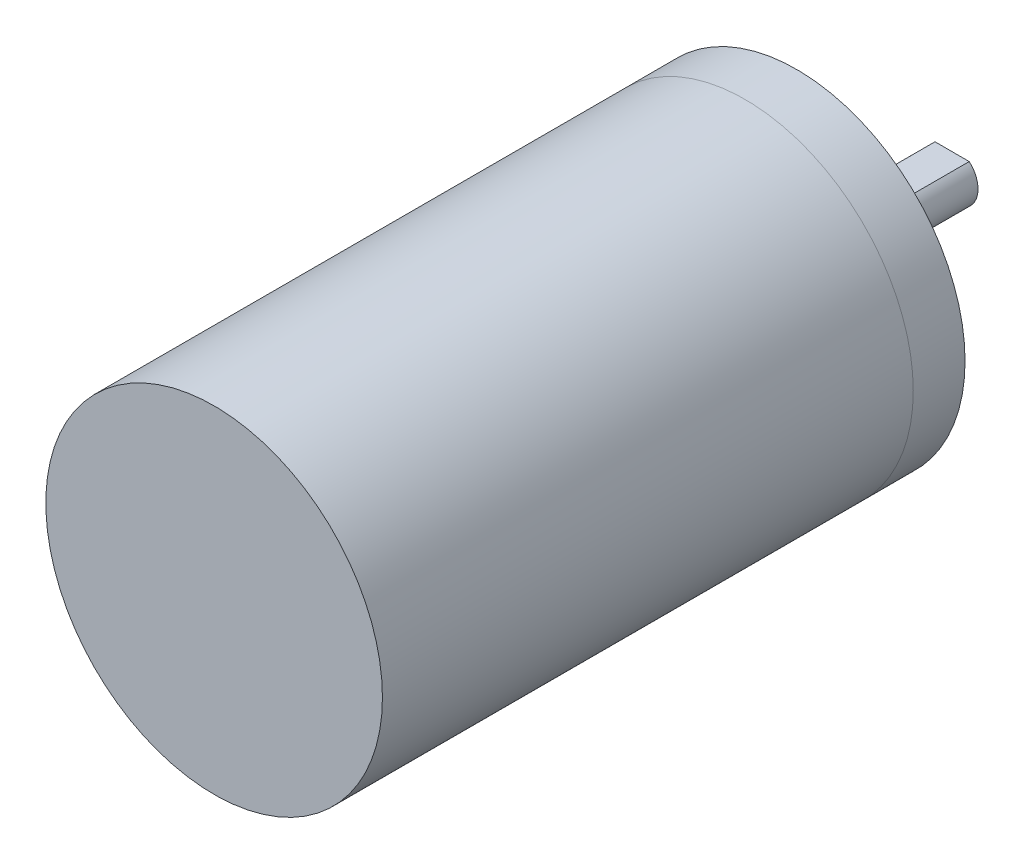
ISO-10303-21;
HEADER;
FILE_DESCRIPTION(('STEP AP214'),'2;1');
FILE_NAME('part.step','',(''),(''),'','','');
FILE_SCHEMA(('AUTOMOTIVE_DESIGN { 1 0 10303 214 1 1 1 1 }'));
ENDSEC;
DATA;
#1=APPLICATION_CONTEXT('core data for automotive mechanical design processes');
#2=APPLICATION_PROTOCOL_DEFINITION('international standard','automotive_design',2000,#1);
#3=PRODUCT_CONTEXT('',#1,'mechanical');
#4=PRODUCT('Part','Part','',(#3));
#5=PRODUCT_RELATED_PRODUCT_CATEGORY('part','',(#4));
#6=PRODUCT_DEFINITION_FORMATION('','',#4);
#7=PRODUCT_DEFINITION_CONTEXT('part definition',#1,'design');
#8=PRODUCT_DEFINITION('design','',#6,#7);
#9=PRODUCT_DEFINITION_SHAPE('','',#8);
#10=(LENGTH_UNIT() NAMED_UNIT(*) SI_UNIT(.MILLI.,.METRE.));
#11=(NAMED_UNIT(*) PLANE_ANGLE_UNIT() SI_UNIT($,.RADIAN.));
#12=(NAMED_UNIT(*) SI_UNIT($,.STERADIAN.) SOLID_ANGLE_UNIT());
#13=UNCERTAINTY_MEASURE_WITH_UNIT(LENGTH_MEASURE(1.E-05),#10,'distance_accuracy_value','');
#14=(GEOMETRIC_REPRESENTATION_CONTEXT(3) GLOBAL_UNCERTAINTY_ASSIGNED_CONTEXT((#13)) GLOBAL_UNIT_ASSIGNED_CONTEXT((#10,
#11,#12)) REPRESENTATION_CONTEXT('',''));
#15=CARTESIAN_POINT('',(0.,0.,0.));
#16=DIRECTION('',(0.,0.,1.));
#17=DIRECTION('',(1.,0.,0.));
#18=AXIS2_PLACEMENT_3D('',#15,#16,#17);
#19=CARTESIAN_POINT('',(0.,0.,45.));
#20=DIRECTION('',(0.,0.,-1.));
#21=DIRECTION('',(-1.,0.,0.));
#22=AXIS2_PLACEMENT_3D('',#19,#20,#21);
#23=CYLINDRICAL_SURFACE('',#22,13.);
#24=CARTESIAN_POINT('',(0.,0.,45.));
#25=DIRECTION('',(0.,0.,1.));
#26=DIRECTION('',(1.,0.,0.));
#27=AXIS2_PLACEMENT_3D('',#24,#25,#26);
#28=CIRCLE('',#27,13.);
#29=CARTESIAN_POINT('',(13.,0.,45.));
#30=VERTEX_POINT('',#29);
#31=EDGE_CURVE('E137',#30,#30,#28,.T.);
#32=ORIENTED_EDGE('',*,*,#31,.F.);
#33=EDGE_LOOP('',(#32));
#34=FACE_BOUND('',#33,.T.);
#35=CARTESIAN_POINT('',(0.,0.,4.00000000000001));
#36=DIRECTION('',(0.,0.,-1.));
#37=DIRECTION('',(-1.,0.,0.));
#38=AXIS2_PLACEMENT_3D('',#35,#36,#37);
#39=CIRCLE('',#38,13.);
#40=CARTESIAN_POINT('',(-13.,0.,4.00000000000001));
#41=VERTEX_POINT('',#40);
#42=CARTESIAN_POINT('',(13.,0.,4.00000000000001));
#43=VERTEX_POINT('',#42);
#44=EDGE_CURVE('E12',#41,#43,#39,.T.);
#45=ORIENTED_EDGE('',*,*,#44,.F.);
#46=EDGE_CURVE('E53',#43,#41,#39,.T.);
#47=ORIENTED_EDGE('',*,*,#46,.F.);
#48=EDGE_LOOP('',(#45,#47));
#49=FACE_BOUND('',#48,.T.);
#50=ADVANCED_FACE('F49',(#34,#49),#23,.T.);
#51=CARTESIAN_POINT('',(0.,1.5,-12.));
#52=DIRECTION('',(0.,1.,0.));
#53=DIRECTION('',(0.,0.,1.));
#54=AXIS2_PLACEMENT_3D('',#51,#52,#53);
#55=PLANE('',#54);
#56=DIRECTION('',(0.,0.,1.));
#57=VECTOR('',#56,1.);
#58=CARTESIAN_POINT('',(-1.3228756555323,1.5,-12.));
#59=LINE('',#58,#57);
#60=CARTESIAN_POINT('',(-1.3228756555323,1.5,-12.));
#61=VERTEX_POINT('',#60);
#62=CARTESIAN_POINT('',(-1.3228756555323,1.5,-4.));
#63=VERTEX_POINT('',#62);
#64=EDGE_CURVE('E125',#61,#63,#59,.T.);
#65=ORIENTED_EDGE('',*,*,#64,.T.);
#66=DIRECTION('',(1.,0.,0.));
#67=VECTOR('',#66,1.);
#68=CARTESIAN_POINT('',(0.,1.5,-4.));
#69=LINE('',#68,#67);
#70=CARTESIAN_POINT('',(1.3228756555323,1.5,-4.));
#71=VERTEX_POINT('',#70);
#72=EDGE_CURVE('E109',#63,#71,#69,.T.);
#73=ORIENTED_EDGE('',*,*,#72,.T.);
#74=DIRECTION('',(0.,0.,1.));
#75=VECTOR('',#74,1.);
#76=CARTESIAN_POINT('',(1.3228756555323,1.5,-12.));
#77=LINE('',#76,#75);
#78=CARTESIAN_POINT('',(1.3228756555323,1.5,-12.));
#79=VERTEX_POINT('',#78);
#80=EDGE_CURVE('E129',#79,#71,#77,.T.);
#81=ORIENTED_EDGE('',*,*,#80,.F.);
#82=DIRECTION('',(-1.,0.,0.));
#83=VECTOR('',#82,1.);
#84=CARTESIAN_POINT('',(0.,1.5,-12.));
#85=LINE('',#84,#83);
#86=EDGE_CURVE('E117',#79,#61,#85,.T.);
#87=ORIENTED_EDGE('',*,*,#86,.T.);
#88=EDGE_LOOP('',(#65,#73,#81,#87));
#89=FACE_BOUND('',#88,.T.);
#90=ADVANCED_FACE('F162',(#89),#55,.T.);
#91=ORIENTED_EDGE('',*,*,#46,.T.);
#92=ORIENTED_EDGE('',*,*,#44,.T.);
#93=EDGE_LOOP('',(#91,#92));
#94=FACE_BOUND('',#93,.T.);
#95=CARTESIAN_POINT('',(0.,0.,0.));
#96=DIRECTION('',(0.,0.,1.));
#97=DIRECTION('',(1.,0.,0.));
#98=AXIS2_PLACEMENT_3D('',#95,#96,#97);
#99=CIRCLE('',#98,13.);
#100=CARTESIAN_POINT('',(13.,0.,0.));
#101=VERTEX_POINT('',#100);
#102=EDGE_CURVE('E133',#101,#101,#99,.T.);
#103=ORIENTED_EDGE('',*,*,#102,.T.);
#104=EDGE_LOOP('',(#103));
#105=FACE_BOUND('',#104,.T.);
#106=ADVANCED_FACE('F51',(#94,#105),#23,.T.);
#107=CARTESIAN_POINT('',(0.,0.,45.));
#108=DIRECTION('',(0.,0.,1.));
#109=DIRECTION('',(1.,0.,0.));
#110=AXIS2_PLACEMENT_3D('',#107,#108,#109);
#111=PLANE('',#110);
#112=ORIENTED_EDGE('',*,*,#31,.T.);
#113=EDGE_LOOP('',(#112));
#114=FACE_BOUND('',#113,.T.);
#115=ADVANCED_FACE('F148',(#114),#111,.T.);
#116=CARTESIAN_POINT('',(0.,0.,0.));
#117=DIRECTION('',(0.,0.,1.));
#118=DIRECTION('',(1.,0.,0.));
#119=AXIS2_PLACEMENT_3D('',#116,#117,#118);
#120=PLANE('',#119);
#121=CARTESIAN_POINT('',(10.,0.,0.));
#122=DIRECTION('',(0.,0.,-1.));
#123=DIRECTION('',(-1.,0.,0.));
#124=AXIS2_PLACEMENT_3D('',#121,#122,#123);
#125=CIRCLE('',#124,1.49999999999999);
#126=CARTESIAN_POINT('',(8.50000000000001,0.,0.));
#127=VERTEX_POINT('',#126);
#128=EDGE_CURVE('E96',#127,#127,#125,.T.);
#129=ORIENTED_EDGE('',*,*,#128,.F.);
#130=EDGE_LOOP('',(#129));
#131=FACE_BOUND('',#130,.T.);
#132=CARTESIAN_POINT('',(-10.,0.,0.));
#133=DIRECTION('',(0.,0.,-1.));
#134=DIRECTION('',(-1.,0.,0.));
#135=AXIS2_PLACEMENT_3D('',#132,#133,#134);
#136=CIRCLE('',#135,1.49999999999999);
#137=CARTESIAN_POINT('',(-11.5,0.,0.));
#138=VERTEX_POINT('',#137);
#139=EDGE_CURVE('E95',#138,#138,#136,.T.);
#140=ORIENTED_EDGE('',*,*,#139,.F.);
#141=EDGE_LOOP('',(#140));
#142=FACE_BOUND('',#141,.T.);
#143=CARTESIAN_POINT('',(0.,0.,0.));
#144=DIRECTION('',(0.,0.,1.));
#145=DIRECTION('',(1.,0.,0.));
#146=AXIS2_PLACEMENT_3D('',#143,#144,#145);
#147=CIRCLE('',#146,2.);
#148=CARTESIAN_POINT('',(2.,0.,0.));
#149=VERTEX_POINT('',#148);
#150=EDGE_CURVE('E116',#149,#149,#147,.T.);
#151=ORIENTED_EDGE('',*,*,#150,.T.);
#152=EDGE_LOOP('',(#151));
#153=FACE_BOUND('',#152,.T.);
#154=ORIENTED_EDGE('',*,*,#102,.F.);
#155=EDGE_LOOP('',(#154));
#156=FACE_BOUND('',#155,.T.);
#157=ADVANCED_FACE('F145',(#131,#142,#153,#156),#120,.F.);
#158=CARTESIAN_POINT('',(0.,0.,-12.));
#159=DIRECTION('',(0.,0.,1.));
#160=DIRECTION('',(1.,0.,0.));
#161=AXIS2_PLACEMENT_3D('',#158,#159,#160);
#162=CYLINDRICAL_SURFACE('',#161,2.);
#163=ORIENTED_EDGE('',*,*,#150,.F.);
#164=EDGE_LOOP('',(#163));
#165=FACE_BOUND('',#164,.T.);
#166=CARTESIAN_POINT('',(0.,0.,-4.));
#167=DIRECTION('',(0.,0.,1.));
#168=DIRECTION('',(1.,0.,0.));
#169=AXIS2_PLACEMENT_3D('',#166,#167,#168);
#170=CIRCLE('',#169,2.);
#171=EDGE_CURVE('E113',#63,#71,#170,.F.);
#172=ORIENTED_EDGE('',*,*,#171,.F.);
#173=ORIENTED_EDGE('',*,*,#64,.F.);
#174=CARTESIAN_POINT('',(0.,0.,-12.));
#175=DIRECTION('',(0.,0.,1.));
#176=DIRECTION('',(1.,0.,0.));
#177=AXIS2_PLACEMENT_3D('',#174,#175,#176);
#178=CIRCLE('',#177,2.);
#179=EDGE_CURVE('E121',#61,#79,#178,.T.);
#180=ORIENTED_EDGE('',*,*,#179,.T.);
#181=ORIENTED_EDGE('',*,*,#80,.T.);
#182=EDGE_LOOP('',(#172,#173,#180,#181));
#183=FACE_BOUND('',#182,.T.);
#184=ADVANCED_FACE('F147',(#165,#183),#162,.T.);
#185=CARTESIAN_POINT('',(0.,0.,-12.));
#186=DIRECTION('',(0.,0.,1.));
#187=DIRECTION('',(1.,0.,0.));
#188=AXIS2_PLACEMENT_3D('',#185,#186,#187);
#189=PLANE('',#188);
#190=ORIENTED_EDGE('',*,*,#86,.F.);
#191=ORIENTED_EDGE('',*,*,#179,.F.);
#192=EDGE_LOOP('',(#190,#191));
#193=FACE_BOUND('',#192,.T.);
#194=ADVANCED_FACE('F154',(#193),#189,.F.);
#195=CARTESIAN_POINT('',(0.,0.,-4.));
#196=DIRECTION('',(0.,0.,1.));
#197=DIRECTION('',(1.,0.,0.));
#198=AXIS2_PLACEMENT_3D('',#195,#196,#197);
#199=PLANE('',#198);
#200=ORIENTED_EDGE('',*,*,#171,.T.);
#201=ORIENTED_EDGE('',*,*,#72,.F.);
#202=EDGE_LOOP('',(#200,#201));
#203=FACE_BOUND('',#202,.T.);
#204=ADVANCED_FACE('F196',(#203),#199,.F.);
#205=CARTESIAN_POINT('',(-10.,0.,5.));
#206=DIRECTION('',(0.,0.,-1.));
#207=DIRECTION('',(-1.,0.,0.));
#208=AXIS2_PLACEMENT_3D('',#205,#206,#207);
#209=CONICAL_SURFACE('',#208,1.49999999999999,1.02974425867665);
#210=CARTESIAN_POINT('',(-10.,0.,5.90129092854134));
#211=VERTEX_POINT('',#210);
#212=VERTEX_LOOP('',#211);
#213=FACE_BOUND('',#212,.T.);
#214=CARTESIAN_POINT('',(-10.,0.,5.));
#215=DIRECTION('',(0.,0.,-1.));
#216=DIRECTION('',(-1.,0.,0.));
#217=AXIS2_PLACEMENT_3D('',#214,#215,#216);
#218=CIRCLE('',#217,1.49999999999999);
#219=CARTESIAN_POINT('',(-11.5,0.,5.));
#220=VERTEX_POINT('',#219);
#221=EDGE_CURVE('E101',#220,#220,#218,.T.);
#222=ORIENTED_EDGE('',*,*,#221,.T.);
#223=EDGE_LOOP('',(#222));
#224=FACE_BOUND('',#223,.T.);
#225=ADVANCED_FACE('F217',(#213,#224),#209,.F.);
#226=CARTESIAN_POINT('',(-10.,0.,0.));
#227=DIRECTION('',(0.,0.,-1.));
#228=DIRECTION('',(-1.,0.,0.));
#229=AXIS2_PLACEMENT_3D('',#226,#227,#228);
#230=CYLINDRICAL_SURFACE('',#229,1.49999999999999);
#231=ORIENTED_EDGE('',*,*,#221,.F.);
#232=EDGE_LOOP('',(#231));
#233=FACE_BOUND('',#232,.T.);
#234=ORIENTED_EDGE('',*,*,#139,.T.);
#235=EDGE_LOOP('',(#234));
#236=FACE_BOUND('',#235,.T.);
#237=ADVANCED_FACE('F88',(#233,#236),#230,.F.);
#238=CARTESIAN_POINT('',(10.,0.,5.));
#239=DIRECTION('',(0.,0.,-1.));
#240=DIRECTION('',(-1.,0.,0.));
#241=AXIS2_PLACEMENT_3D('',#238,#239,#240);
#242=CONICAL_SURFACE('',#241,1.49999999999999,1.02974425867665);
#243=CARTESIAN_POINT('',(10.,0.,5.90129092854134));
#244=VERTEX_POINT('',#243);
#245=VERTEX_LOOP('',#244);
#246=FACE_BOUND('',#245,.T.);
#247=CARTESIAN_POINT('',(10.,0.,5.));
#248=DIRECTION('',(0.,0.,-1.));
#249=DIRECTION('',(-1.,0.,0.));
#250=AXIS2_PLACEMENT_3D('',#247,#248,#249);
#251=CIRCLE('',#250,1.49999999999999);
#252=CARTESIAN_POINT('',(8.50000000000001,0.,5.));
#253=VERTEX_POINT('',#252);
#254=EDGE_CURVE('E92',#253,#253,#251,.T.);
#255=ORIENTED_EDGE('',*,*,#254,.T.);
#256=EDGE_LOOP('',(#255));
#257=FACE_BOUND('',#256,.T.);
#258=ADVANCED_FACE('F84',(#246,#257),#242,.F.);
#259=CARTESIAN_POINT('',(10.,0.,0.));
#260=DIRECTION('',(0.,0.,-1.));
#261=DIRECTION('',(-1.,0.,0.));
#262=AXIS2_PLACEMENT_3D('',#259,#260,#261);
#263=CYLINDRICAL_SURFACE('',#262,1.49999999999999);
#264=ORIENTED_EDGE('',*,*,#254,.F.);
#265=EDGE_LOOP('',(#264));
#266=FACE_BOUND('',#265,.T.);
#267=ORIENTED_EDGE('',*,*,#128,.T.);
#268=EDGE_LOOP('',(#267));
#269=FACE_BOUND('',#268,.T.);
#270=ADVANCED_FACE('F87',(#266,#269),#263,.F.);
#271=CLOSED_SHELL('',(#50,#90,#106,#115,#157,#184,#194,#204,#225,#237,#258,#270));
#272=MANIFOLD_SOLID_BREP('B2',#271);
#273=ADVANCED_BREP_SHAPE_REPRESENTATION('',(#18,#272),#14);
#274=SHAPE_DEFINITION_REPRESENTATION(#9,#273);
ENDSEC;
END-ISO-10303-21;
